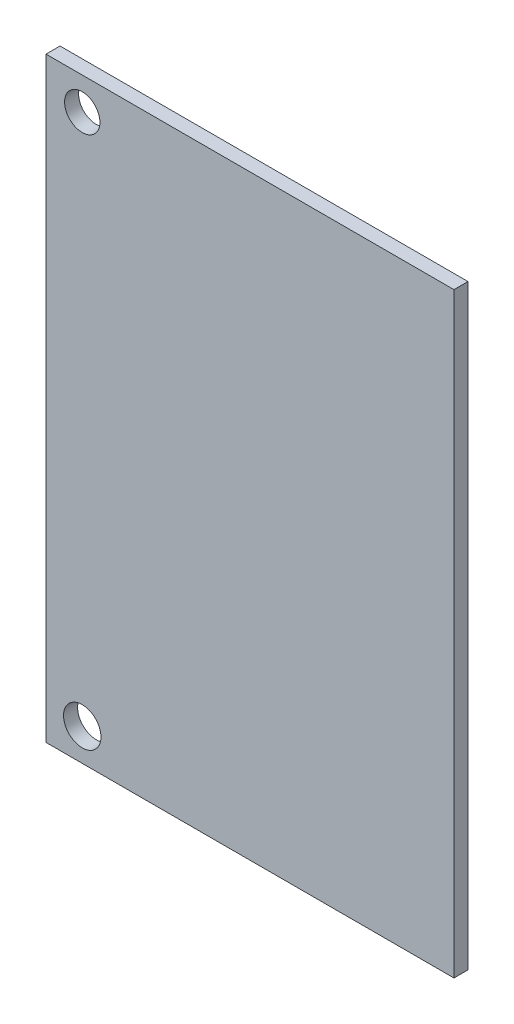
ISO-10303-21;
HEADER;
FILE_DESCRIPTION(('STEP AP214'),'2;1');
FILE_NAME('part.step','',(''),(''),'','','');
FILE_SCHEMA(('AUTOMOTIVE_DESIGN { 1 0 10303 214 1 1 1 1 }'));
ENDSEC;
DATA;
#1=APPLICATION_CONTEXT('core data for automotive mechanical design processes');
#2=APPLICATION_PROTOCOL_DEFINITION('international standard','automotive_design',2000,#1);
#3=PRODUCT_CONTEXT('',#1,'mechanical');
#4=PRODUCT('Part','Part','',(#3));
#5=PRODUCT_RELATED_PRODUCT_CATEGORY('part','',(#4));
#6=PRODUCT_DEFINITION_FORMATION('','',#4);
#7=PRODUCT_DEFINITION_CONTEXT('part definition',#1,'design');
#8=PRODUCT_DEFINITION('design','',#6,#7);
#9=PRODUCT_DEFINITION_SHAPE('','',#8);
#10=(LENGTH_UNIT() NAMED_UNIT(*) SI_UNIT(.MILLI.,.METRE.));
#11=(NAMED_UNIT(*) PLANE_ANGLE_UNIT() SI_UNIT($,.RADIAN.));
#12=(NAMED_UNIT(*) SI_UNIT($,.STERADIAN.) SOLID_ANGLE_UNIT());
#13=UNCERTAINTY_MEASURE_WITH_UNIT(LENGTH_MEASURE(1.E-05),#10,'distance_accuracy_value','');
#14=(GEOMETRIC_REPRESENTATION_CONTEXT(3) GLOBAL_UNCERTAINTY_ASSIGNED_CONTEXT((#13)) GLOBAL_UNIT_ASSIGNED_CONTEXT((#10,
#11,#12)) REPRESENTATION_CONTEXT('',''));
#15=CARTESIAN_POINT('',(0.,0.,0.));
#16=DIRECTION('',(0.,0.,1.));
#17=DIRECTION('',(1.,0.,0.));
#18=AXIS2_PLACEMENT_3D('',#15,#16,#17);
#19=CARTESIAN_POINT('',(0.,0.,1.2));
#20=DIRECTION('',(0.,0.,1.));
#21=DIRECTION('',(1.,0.,0.));
#22=AXIS2_PLACEMENT_3D('',#19,#20,#21);
#23=PLANE('',#22);
#24=DIRECTION('',(0.,-1.,0.));
#25=VECTOR('',#24,1.);
#26=CARTESIAN_POINT('',(-305.123327030624,33.2826153711837,1.2));
#27=LINE('',#26,#25);
#28=CARTESIAN_POINT('',(-305.123327030624,33.2826153711837,1.2));
#29=VERTEX_POINT('',#28);
#30=CARTESIAN_POINT('',(-305.123327030624,-17.7173846288163,1.2));
#31=VERTEX_POINT('',#30);
#32=EDGE_CURVE('E122',#29,#31,#27,.T.);
#33=ORIENTED_EDGE('',*,*,#32,.F.);
#34=DIRECTION('',(-1.,0.,0.));
#35=VECTOR('',#34,1.);
#36=CARTESIAN_POINT('',(-340.023327030624,33.2826153711837,1.2));
#37=LINE('',#36,#35);
#38=CARTESIAN_POINT('',(-340.023327030624,33.2826153711837,1.2));
#39=VERTEX_POINT('',#38);
#40=EDGE_CURVE('E70',#29,#39,#37,.T.);
#41=ORIENTED_EDGE('',*,*,#40,.T.);
#42=DIRECTION('',(0.,-1.,0.));
#43=VECTOR('',#42,1.);
#44=CARTESIAN_POINT('',(-340.023327030624,33.2826153711837,1.2));
#45=LINE('',#44,#43);
#46=CARTESIAN_POINT('',(-340.023327030624,-17.7173846288163,1.2));
#47=VERTEX_POINT('',#46);
#48=EDGE_CURVE('E87',#39,#47,#45,.T.);
#49=ORIENTED_EDGE('',*,*,#48,.T.);
#50=DIRECTION('',(1.,0.,0.));
#51=VECTOR('',#50,1.);
#52=CARTESIAN_POINT('',(-340.023327030624,-17.7173846288163,1.2));
#53=LINE('',#52,#51);
#54=EDGE_CURVE('E104',#47,#31,#53,.T.);
#55=ORIENTED_EDGE('',*,*,#54,.T.);
#56=EDGE_LOOP('',(#33,#41,#49,#55));
#57=FACE_BOUND('',#56,.T.);
#58=CARTESIAN_POINT('',(-336.923327030624,30.5326153711837,1.2));
#59=DIRECTION('',(0.,0.,1.));
#60=DIRECTION('',(1.,0.,0.));
#61=AXIS2_PLACEMENT_3D('',#58,#59,#60);
#62=CIRCLE('',#61,1.51211917062415);
#63=CARTESIAN_POINT('',(-335.411207859999,30.5326153711837,1.2));
#64=VERTEX_POINT('',#63);
#65=EDGE_CURVE('E100',#64,#64,#62,.T.);
#66=ORIENTED_EDGE('',*,*,#65,.F.);
#67=EDGE_LOOP('',(#66));
#68=FACE_BOUND('',#67,.T.);
#69=CARTESIAN_POINT('',(-336.923327030624,-14.9673846288163,1.2));
#70=DIRECTION('',(0.,0.,1.));
#71=DIRECTION('',(1.,0.,0.));
#72=AXIS2_PLACEMENT_3D('',#69,#70,#71);
#73=CIRCLE('',#72,1.59999999999996);
#74=CARTESIAN_POINT('',(-335.323327030624,-14.9673846288163,1.2));
#75=VERTEX_POINT('',#74);
#76=EDGE_CURVE('E109',#75,#75,#73,.T.);
#77=ORIENTED_EDGE('',*,*,#76,.F.);
#78=EDGE_LOOP('',(#77));
#79=FACE_BOUND('',#78,.T.);
#80=ADVANCED_FACE('F43',(#57,#68,#79),#23,.T.);
#81=CARTESIAN_POINT('',(0.,0.,0.));
#82=DIRECTION('',(0.,0.,1.));
#83=DIRECTION('',(1.,0.,0.));
#84=AXIS2_PLACEMENT_3D('',#81,#82,#83);
#85=PLANE('',#84);
#86=DIRECTION('',(-1.,0.,0.));
#87=VECTOR('',#86,1.);
#88=CARTESIAN_POINT('',(-340.023327030624,33.2826153711837,0.));
#89=LINE('',#88,#87);
#90=CARTESIAN_POINT('',(-305.123327030624,33.2826153711837,0.));
#91=VERTEX_POINT('',#90);
#92=CARTESIAN_POINT('',(-340.023327030624,33.2826153711837,0.));
#93=VERTEX_POINT('',#92);
#94=EDGE_CURVE('E77',#91,#93,#89,.T.);
#95=ORIENTED_EDGE('',*,*,#94,.F.);
#96=DIRECTION('',(0.,-1.,0.));
#97=VECTOR('',#96,1.);
#98=CARTESIAN_POINT('',(-305.123327030624,33.2826153711837,0.));
#99=LINE('',#98,#97);
#100=CARTESIAN_POINT('',(-305.123327030624,-17.7173846288163,0.));
#101=VERTEX_POINT('',#100);
#102=EDGE_CURVE('E59',#91,#101,#99,.T.);
#103=ORIENTED_EDGE('',*,*,#102,.T.);
#104=DIRECTION('',(1.,0.,0.));
#105=VECTOR('',#104,1.);
#106=CARTESIAN_POINT('',(-340.023327030624,-17.7173846288163,0.));
#107=LINE('',#106,#105);
#108=CARTESIAN_POINT('',(-340.023327030624,-17.7173846288163,0.));
#109=VERTEX_POINT('',#108);
#110=EDGE_CURVE('E86',#109,#101,#107,.T.);
#111=ORIENTED_EDGE('',*,*,#110,.F.);
#112=DIRECTION('',(0.,-1.,0.));
#113=VECTOR('',#112,1.);
#114=CARTESIAN_POINT('',(-340.023327030624,33.2826153711837,0.));
#115=LINE('',#114,#113);
#116=EDGE_CURVE('E91',#93,#109,#115,.T.);
#117=ORIENTED_EDGE('',*,*,#116,.F.);
#118=EDGE_LOOP('',(#95,#103,#111,#117));
#119=FACE_BOUND('',#118,.T.);
#120=CARTESIAN_POINT('',(-336.923327030624,30.5326153711837,0.));
#121=DIRECTION('',(0.,0.,1.));
#122=DIRECTION('',(1.,0.,0.));
#123=AXIS2_PLACEMENT_3D('',#120,#121,#122);
#124=CIRCLE('',#123,1.51211917062415);
#125=CARTESIAN_POINT('',(-335.411207859999,30.5326153711837,0.));
#126=VERTEX_POINT('',#125);
#127=EDGE_CURVE('E101',#126,#126,#124,.T.);
#128=ORIENTED_EDGE('',*,*,#127,.T.);
#129=EDGE_LOOP('',(#128));
#130=FACE_BOUND('',#129,.T.);
#131=CARTESIAN_POINT('',(-336.923327030624,-14.9673846288163,0.));
#132=DIRECTION('',(0.,0.,1.));
#133=DIRECTION('',(1.,0.,0.));
#134=AXIS2_PLACEMENT_3D('',#131,#132,#133);
#135=CIRCLE('',#134,1.59999999999996);
#136=CARTESIAN_POINT('',(-335.323327030624,-14.9673846288163,0.));
#137=VERTEX_POINT('',#136);
#138=EDGE_CURVE('E115',#137,#137,#135,.T.);
#139=ORIENTED_EDGE('',*,*,#138,.T.);
#140=EDGE_LOOP('',(#139));
#141=FACE_BOUND('',#140,.T.);
#142=ADVANCED_FACE('F94',(#119,#130,#141),#85,.F.);
#143=CARTESIAN_POINT('',(-340.023327030624,33.2826153711837,1.2));
#144=DIRECTION('',(1.,0.,0.));
#145=DIRECTION('',(0.,0.,-1.));
#146=AXIS2_PLACEMENT_3D('',#143,#144,#145);
#147=PLANE('',#146);
#148=ORIENTED_EDGE('',*,*,#116,.T.);
#149=DIRECTION('',(0.,0.,-1.));
#150=VECTOR('',#149,1.);
#151=CARTESIAN_POINT('',(-340.023327030624,-17.7173846288163,1.2));
#152=LINE('',#151,#150);
#153=EDGE_CURVE('E11',#47,#109,#152,.T.);
#154=ORIENTED_EDGE('',*,*,#153,.F.);
#155=ORIENTED_EDGE('',*,*,#48,.F.);
#156=DIRECTION('',(0.,0.,-1.));
#157=VECTOR('',#156,1.);
#158=CARTESIAN_POINT('',(-340.023327030624,33.2826153711837,1.2));
#159=LINE('',#158,#157);
#160=EDGE_CURVE('E51',#39,#93,#159,.T.);
#161=ORIENTED_EDGE('',*,*,#160,.T.);
#162=EDGE_LOOP('',(#148,#154,#155,#161));
#163=FACE_BOUND('',#162,.T.);
#164=ADVANCED_FACE('F44',(#163),#147,.F.);
#165=CARTESIAN_POINT('',(-340.023327030624,-17.7173846288163,1.2));
#166=DIRECTION('',(0.,1.,0.));
#167=DIRECTION('',(-1.,0.,0.));
#168=AXIS2_PLACEMENT_3D('',#165,#166,#167);
#169=PLANE('',#168);
#170=ORIENTED_EDGE('',*,*,#110,.T.);
#171=DIRECTION('',(0.,0.,1.));
#172=VECTOR('',#171,1.);
#173=CARTESIAN_POINT('',(-305.123327030624,-17.7173846288163,0.));
#174=LINE('',#173,#172);
#175=EDGE_CURVE('E116',#101,#31,#174,.T.);
#176=ORIENTED_EDGE('',*,*,#175,.T.);
#177=ORIENTED_EDGE('',*,*,#54,.F.);
#178=ORIENTED_EDGE('',*,*,#153,.T.);
#179=EDGE_LOOP('',(#170,#176,#177,#178));
#180=FACE_BOUND('',#179,.T.);
#181=ADVANCED_FACE('F130',(#180),#169,.F.);
#182=CARTESIAN_POINT('',(-340.023327030624,33.2826153711837,1.2));
#183=DIRECTION('',(0.,-1.,0.));
#184=DIRECTION('',(1.,0.,0.));
#185=AXIS2_PLACEMENT_3D('',#182,#183,#184);
#186=PLANE('',#185);
#187=ORIENTED_EDGE('',*,*,#40,.F.);
#188=DIRECTION('',(0.,0.,1.));
#189=VECTOR('',#188,1.);
#190=CARTESIAN_POINT('',(-305.123327030624,33.2826153711837,0.));
#191=LINE('',#190,#189);
#192=EDGE_CURVE('E81',#91,#29,#191,.T.);
#193=ORIENTED_EDGE('',*,*,#192,.F.);
#194=ORIENTED_EDGE('',*,*,#94,.T.);
#195=ORIENTED_EDGE('',*,*,#160,.F.);
#196=EDGE_LOOP('',(#187,#193,#194,#195));
#197=FACE_BOUND('',#196,.T.);
#198=ADVANCED_FACE('F85',(#197),#186,.F.);
#199=CARTESIAN_POINT('',(-336.923327030624,30.5326153711837,1.2));
#200=DIRECTION('',(0.,0.,-1.));
#201=DIRECTION('',(-1.,0.,0.));
#202=AXIS2_PLACEMENT_3D('',#199,#200,#201);
#203=CYLINDRICAL_SURFACE('',#202,1.51211917062415);
#204=ORIENTED_EDGE('',*,*,#65,.T.);
#205=EDGE_LOOP('',(#204));
#206=FACE_BOUND('',#205,.T.);
#207=ORIENTED_EDGE('',*,*,#127,.F.);
#208=EDGE_LOOP('',(#207));
#209=FACE_BOUND('',#208,.T.);
#210=ADVANCED_FACE('F138',(#206,#209),#203,.F.);
#211=CARTESIAN_POINT('',(-336.923327030624,-14.9673846288163,1.2));
#212=DIRECTION('',(0.,0.,-1.));
#213=DIRECTION('',(-1.,0.,0.));
#214=AXIS2_PLACEMENT_3D('',#211,#212,#213);
#215=CYLINDRICAL_SURFACE('',#214,1.59999999999996);
#216=ORIENTED_EDGE('',*,*,#76,.T.);
#217=EDGE_LOOP('',(#216));
#218=FACE_BOUND('',#217,.T.);
#219=ORIENTED_EDGE('',*,*,#138,.F.);
#220=EDGE_LOOP('',(#219));
#221=FACE_BOUND('',#220,.T.);
#222=ADVANCED_FACE('F137',(#218,#221),#215,.F.);
#223=CARTESIAN_POINT('',(-305.123327030624,33.2826153711837,0.));
#224=DIRECTION('',(-1.,0.,0.));
#225=DIRECTION('',(0.,0.,1.));
#226=AXIS2_PLACEMENT_3D('',#223,#224,#225);
#227=PLANE('',#226);
#228=ORIENTED_EDGE('',*,*,#32,.T.);
#229=ORIENTED_EDGE('',*,*,#175,.F.);
#230=ORIENTED_EDGE('',*,*,#102,.F.);
#231=ORIENTED_EDGE('',*,*,#192,.T.);
#232=EDGE_LOOP('',(#228,#229,#230,#231));
#233=FACE_BOUND('',#232,.T.);
#234=ADVANCED_FACE('F136',(#233),#227,.F.);
#235=CLOSED_SHELL('',(#80,#142,#164,#181,#198,#210,#222,#234));
#236=MANIFOLD_SOLID_BREP('B2',#235);
#237=ADVANCED_BREP_SHAPE_REPRESENTATION('',(#18,#236),#14);
#238=SHAPE_DEFINITION_REPRESENTATION(#9,#237);
ENDSEC;
END-ISO-10303-21;
